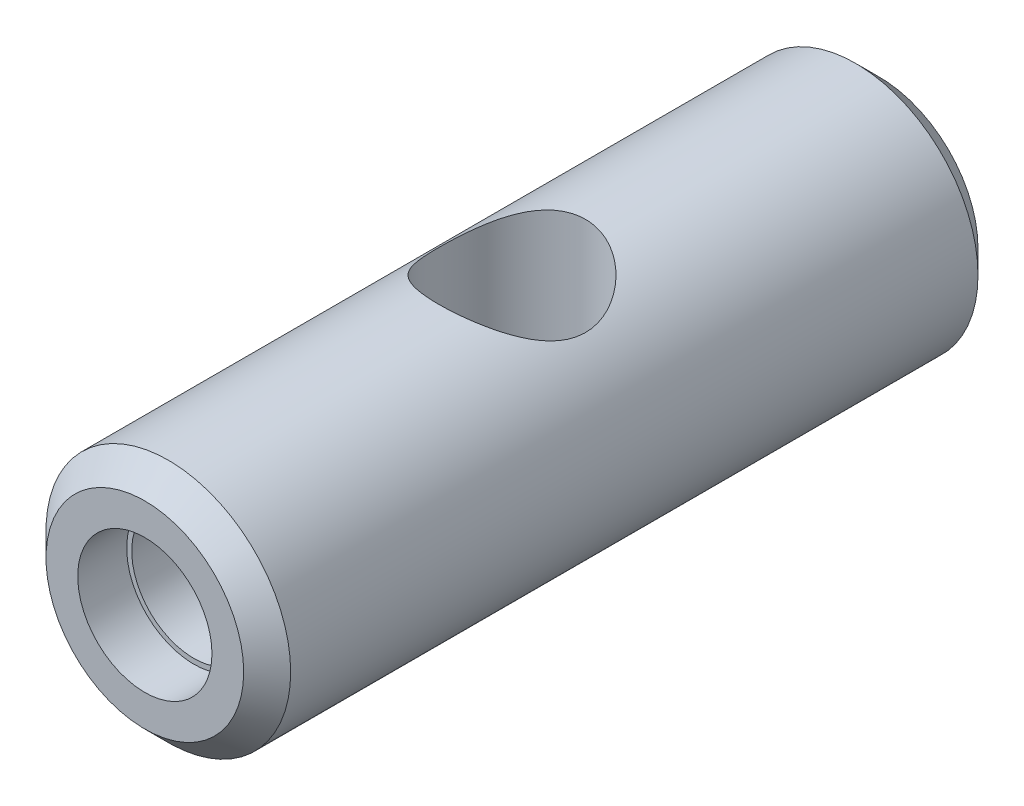
ISO-10303-21;
HEADER;
FILE_DESCRIPTION(('STEP AP214'),'2;1');
FILE_NAME('part.step','',(''),(''),'','','');
FILE_SCHEMA(('AUTOMOTIVE_DESIGN { 1 0 10303 214 1 1 1 1 }'));
ENDSEC;
DATA;
#1=APPLICATION_CONTEXT('core data for automotive mechanical design processes');
#2=APPLICATION_PROTOCOL_DEFINITION('international standard','automotive_design',2000,#1);
#3=PRODUCT_CONTEXT('',#1,'mechanical');
#4=PRODUCT('Part','Part','',(#3));
#5=PRODUCT_RELATED_PRODUCT_CATEGORY('part','',(#4));
#6=PRODUCT_DEFINITION_FORMATION('','',#4);
#7=PRODUCT_DEFINITION_CONTEXT('part definition',#1,'design');
#8=PRODUCT_DEFINITION('design','',#6,#7);
#9=PRODUCT_DEFINITION_SHAPE('','',#8);
#10=(LENGTH_UNIT() NAMED_UNIT(*) SI_UNIT(.MILLI.,.METRE.));
#11=(NAMED_UNIT(*) PLANE_ANGLE_UNIT() SI_UNIT($,.RADIAN.));
#12=(NAMED_UNIT(*) SI_UNIT($,.STERADIAN.) SOLID_ANGLE_UNIT());
#13=UNCERTAINTY_MEASURE_WITH_UNIT(LENGTH_MEASURE(1.E-05),#10,'distance_accuracy_value','');
#14=(GEOMETRIC_REPRESENTATION_CONTEXT(3) GLOBAL_UNCERTAINTY_ASSIGNED_CONTEXT((#13)) GLOBAL_UNIT_ASSIGNED_CONTEXT((#10,
#11,#12)) REPRESENTATION_CONTEXT('',''));
#15=CARTESIAN_POINT('',(0.,0.,0.));
#16=DIRECTION('',(0.,0.,1.));
#17=DIRECTION('',(1.,0.,0.));
#18=AXIS2_PLACEMENT_3D('',#15,#16,#17);
#19=CARTESIAN_POINT('',(0.,0.,-25.4));
#20=DIRECTION('',(0.,0.,1.));
#21=DIRECTION('',(1.,0.,0.));
#22=AXIS2_PLACEMENT_3D('',#19,#20,#21);
#23=CYLINDRICAL_SURFACE('',#22,4.0259);
#24=CARTESIAN_POINT('',(0.,-4.0259,-19.04365));
#25=CARTESIAN_POINT('',(0.0951715588788457,-4.02589935513259,-19.0436506331115));
#26=CARTESIAN_POINT('',(0.190354107953205,-4.02251895840561,-19.0465053689602));
#27=CARTESIAN_POINT('',(0.379943329002704,-4.00905897372343,-19.0578600865215));
#28=CARTESIAN_POINT('',(0.474349584862268,-3.9989760033567,-19.0663629185087));
#29=CARTESIAN_POINT('',(0.661725399407735,-3.97227339038087,-19.0888400955444));
#30=CARTESIAN_POINT('',(0.754692490282597,-3.95564358706478,-19.1028229454468));
#31=CARTESIAN_POINT('',(0.938369708770501,-3.91614297286615,-19.135949820088));
#32=CARTESIAN_POINT('',(1.0290787823465,-3.89326930483979,-19.1550962075728));
#33=CARTESIAN_POINT('',(1.29562606815811,-3.81617556891551,-19.2194137032415));
#34=CARTESIAN_POINT('',(1.46734750560896,-3.75326615257212,-19.2716477594938));
#35=CARTESIAN_POINT('',(1.79614622011273,-3.60751450934685,-19.391358600265));
#36=CARTESIAN_POINT('',(1.95322268697112,-3.52467118058041,-19.4588362273884));
#37=CARTESIAN_POINT('',(2.20461544028762,-3.37075096153011,-19.5822958889287));
#38=CARTESIAN_POINT('',(2.30319516550729,-3.30409808891044,-19.6352723562469));
#39=CARTESIAN_POINT('',(2.49260290452818,-3.16365299718268,-19.7454543488425));
#40=CARTESIAN_POINT('',(2.58343069259313,-3.08986057030431,-19.802659997183));
#41=CARTESIAN_POINT('',(2.7574898112071,-2.93558975073029,-19.9202966234904));
#42=CARTESIAN_POINT('',(2.84069922719046,-2.85509326819434,-19.9807361596509));
#43=CARTESIAN_POINT('',(2.99922106072844,-2.68808400410354,-20.1035044405636));
#44=CARTESIAN_POINT('',(3.07453630741205,-2.60157339651847,-20.1658324981091));
#45=CARTESIAN_POINT('',(3.21870449106821,-2.42103633512858,-20.2923798804203));
#46=CARTESIAN_POINT('',(3.28740407974945,-2.32689679550584,-20.3566124584585));
#47=CARTESIAN_POINT('',(3.41663775014599,-2.13262183181465,-20.4843220616276));
#48=CARTESIAN_POINT('',(3.47716910031853,-2.03248441807957,-20.547798827569));
#49=CARTESIAN_POINT('',(3.58975063536322,-1.82628854115363,-20.6720183644635));
#50=CARTESIAN_POINT('',(3.64181973339441,-1.72024401363257,-20.7327670063964));
#51=CARTESIAN_POINT('',(3.73721922060363,-1.50175340440687,-20.8492614220381));
#52=CARTESIAN_POINT('',(3.78055691727098,-1.38931277765736,-20.9050113573958));
#53=CARTESIAN_POINT('',(3.86078606192954,-1.14868775302973,-21.0123076820266));
#54=CARTESIAN_POINT('',(3.89693455014158,-1.01995657212935,-21.0632099377092));
#55=CARTESIAN_POINT('',(3.95681377650184,-0.75490137464773,-21.1501028571718));
#56=CARTESIAN_POINT('',(3.98057311092933,-0.618595654069689,-21.1861278199033));
#57=CARTESIAN_POINT('',(4.01416577040104,-0.338292281416504,-21.2377306106007));
#58=CARTESIAN_POINT('',(4.02380753565927,-0.194215842838437,-21.2530269710643));
#59=CARTESIAN_POINT('',(4.02737609382669,0.094589448677992,-21.2586410972348));
#60=CARTESIAN_POINT('',(4.02130972244747,0.239317990477822,-21.2489697281569));
#61=CARTESIAN_POINT('',(3.99353725703637,0.531250438537822,-21.2059293108918));
#62=CARTESIAN_POINT('',(3.9710262213837,0.678184904241885,-21.1713419194932));
#63=CARTESIAN_POINT('',(3.91158662420716,0.963734333838936,-21.0841017074641));
#64=CARTESIAN_POINT('',(3.87460830375961,1.10231865907645,-21.0313866148049));
#65=CARTESIAN_POINT('',(3.79643760260929,1.34457114228481,-20.9259011700013));
#66=CARTESIAN_POINT('',(3.75741596607552,1.44983594591551,-20.875083036772));
#67=CARTESIAN_POINT('',(3.67176909366173,1.65478844352906,-20.7687021483159));
#68=CARTESIAN_POINT('',(3.62513908377928,1.75447258274085,-20.7131364246288));
#69=CARTESIAN_POINT('',(3.52458337867779,1.94862773581721,-20.5992420893734));
#70=CARTESIAN_POINT('',(3.47064760008148,2.0430912859594,-20.540909732932));
#71=CARTESIAN_POINT('',(3.35571557831899,2.22683248364258,-20.4231228412301));
#72=CARTESIAN_POINT('',(3.29472084106919,2.31611123119758,-20.3636685475738));
#73=CARTESIAN_POINT('',(3.16160826742307,2.4950574676901,-20.2411059443956));
#74=CARTESIAN_POINT('',(3.08903000159169,2.58438945714769,-20.1780054071824));
#75=CARTESIAN_POINT('',(2.93595575354419,2.75705509394814,-20.0532629268971));
#76=CARTESIAN_POINT('',(2.85545863941941,2.84038788081694,-19.9916211939112));
#77=CARTESIAN_POINT('',(2.60230628237772,3.08056841009861,-19.8109038039301));
#78=CARTESIAN_POINT('',(2.41761600718959,3.22810521601429,-19.6956777062169));
#79=CARTESIAN_POINT('',(2.06027797912258,3.46388003845314,-19.5080062240492));
#80=CARTESIAN_POINT('',(1.89360155787462,3.55804596557551,-19.4316916506134));
#81=CARTESIAN_POINT('',(1.63059782381174,3.68217887963011,-19.330096692771));
#82=CARTESIAN_POINT('',(1.54073498011114,3.72071320911263,-19.2983699655973));
#83=CARTESIAN_POINT('',(1.35706995553349,3.79155740662172,-19.2398017728541));
#84=CARTESIAN_POINT('',(1.26326951365667,3.82386998791665,-19.2129581780624));
#85=CARTESIAN_POINT('',(1.07135801736249,3.88203673280484,-19.1644888257135));
#86=CARTESIAN_POINT('',(0.97321506029561,3.90782823968078,-19.1429137527357));
#87=CARTESIAN_POINT('',(0.774209783015942,3.95206932090219,-19.1058275204001));
#88=CARTESIAN_POINT('',(0.673348915136603,3.9705227364776,-19.0903131885348));
#89=CARTESIAN_POINT('',(0.469783907943892,3.9997175742964,-19.0657392104506));
#90=CARTESIAN_POINT('',(0.367080663706094,4.0104626427348,-19.0566765125014));
#91=CARTESIAN_POINT('',(0.160788164295875,4.02401542003004,-19.045242274409));
#92=CARTESIAN_POINT('',(0.0571990343426826,4.02682423266091,-19.0428698037894));
#93=CARTESIAN_POINT('',(-0.135791386723515,4.02460439542948,-19.0447437137804));
#94=CARTESIAN_POINT('',(-0.225214392000195,4.02058554724749,-19.0481373092685));
#95=CARTESIAN_POINT('',(-0.403278568047433,4.00664808885395,-19.0598926949992));
#96=CARTESIAN_POINT('',(-0.491919488906404,3.99672765750358,-19.0682560188236));
#97=CARTESIAN_POINT('',(-0.755624718579275,3.9583271315569,-19.1005781334519));
#98=CARTESIAN_POINT('',(-0.928657617716613,3.92120521706286,-19.1317713540441));
#99=CARTESIAN_POINT('',(-1.2633748173732,3.82647039332872,-19.2108412738463));
#100=CARTESIAN_POINT('',(-1.4251321444769,3.76900762472075,-19.258595679983));
#101=CARTESIAN_POINT('',(-1.73612170679848,3.63625789063966,-19.367838022489));
#102=CARTESIAN_POINT('',(-1.8853488790352,3.56096376666218,-19.4293314739177));
#103=CARTESIAN_POINT('',(-2.23247054664403,3.35859425165244,-19.5924130047978));
#104=CARTESIAN_POINT('',(-2.42293785658206,3.22330337996369,-19.6997459839458));
#105=CARTESIAN_POINT('',(-2.6858209761213,3.00124773148997,-19.8705043027415));
#106=CARTESIAN_POINT('',(-2.76977523091387,2.92388713810846,-19.9291638516733));
#107=CARTESIAN_POINT('',(-2.93008584925526,2.76320939002708,-20.0486598735178));
#108=CARTESIAN_POINT('',(-3.00644492059345,2.67989437649802,-20.109495560014));
#109=CARTESIAN_POINT('',(-3.15291035854061,2.50603181895416,-20.233329822469));
#110=CARTESIAN_POINT('',(-3.22287483831582,2.4153789520847,-20.2963475901092));
#111=CARTESIAN_POINT('',(-3.35494477283323,2.22830195904832,-20.4221329931941));
#112=CARTESIAN_POINT('',(-3.41704813778308,2.13187630824204,-20.484900557848));
#113=CARTESIAN_POINT('',(-3.53316714072,1.93334088743019,-20.6084664984085));
#114=CARTESIAN_POINT('',(-3.58719640789752,1.83124110454572,-20.6692680538057));
#115=CARTESIAN_POINT('',(-3.68698006500344,1.62098135328922,-20.7869332004435));
#116=CARTESIAN_POINT('',(-3.73273983724936,1.51282538715966,-20.8437993381238));
#117=CARTESIAN_POINT('',(-3.82124190875096,1.2744885481144,-20.9583865210099));
#118=CARTESIAN_POINT('',(-3.86268224119244,1.14333508474385,-21.0151291949601));
#119=CARTESIAN_POINT('',(-3.93268115653665,0.872550104417263,-21.1144153489219));
#120=CARTESIAN_POINT('',(-3.96126821336998,0.732938112692743,-21.1569901601134));
#121=CARTESIAN_POINT('',(-4.00048983370565,0.468049033544125,-21.2165193389078));
#122=CARTESIAN_POINT('',(-4.01316926852893,0.343748953619405,-21.2363522700583));
#123=CARTESIAN_POINT('',(-4.0267777819547,0.092982958293463,-21.2576660832136));
#124=CARTESIAN_POINT('',(-4.02771979286675,-0.0334804196531948,-21.2591671632405));
#125=CARTESIAN_POINT('',(-4.01779821303695,-0.284518342213485,-21.2435910066736));
#126=CARTESIAN_POINT('',(-4.00695239936,-0.409095444582191,-21.2265417455656));
#127=CARTESIAN_POINT('',(-3.97439872390949,-0.653692246122162,-21.1767961231894));
#128=CARTESIAN_POINT('',(-3.9526713467774,-0.773703338887147,-21.1440716540907));
#129=CARTESIAN_POINT('',(-3.90473257094528,-0.985049752225375,-21.0745424350363));
#130=CARTESIAN_POINT('',(-3.8801907274495,-1.0774562973558,-21.0397374026264));
#131=CARTESIAN_POINT('',(-3.82538790810174,-1.25825368723449,-20.9646061245642));
#132=CARTESIAN_POINT('',(-3.79512479045804,-1.34664301269322,-20.9242778128036));
#133=CARTESIAN_POINT('',(-3.72917687540338,-1.51977771758555,-20.839612585215));
#134=CARTESIAN_POINT('',(-3.69347361855541,-1.60450937957711,-20.7952622375339));
#135=CARTESIAN_POINT('',(-3.61700324159818,-1.77016265198485,-20.7040011234399));
#136=CARTESIAN_POINT('',(-3.57623761910449,-1.85108537948705,-20.6570911165503));
#137=CARTESIAN_POINT('',(-3.47139441622145,-2.04299260346833,-20.5414521464035));
#138=CARTESIAN_POINT('',(-3.40477727180074,-2.1521205495612,-20.4719307710747));
#139=CARTESIAN_POINT('',(-3.2617464538424,-2.36329135423157,-20.3321321424613));
#140=CARTESIAN_POINT('',(-3.18532868004988,-2.46533121969068,-20.2618545841532));
#141=CARTESIAN_POINT('',(-3.02286049377132,-2.66203364829714,-20.1225578353076));
#142=CARTESIAN_POINT('',(-2.9368257392441,-2.75670778967106,-20.0535368060514));
#143=CARTESIAN_POINT('',(-2.75501897908678,-2.9384117827701,-19.9183184156999));
#144=CARTESIAN_POINT('',(-2.65924625348248,-3.02544106838697,-19.8521212639017));
#145=CARTESIAN_POINT('',(-2.40487765542559,-3.23481741085485,-19.6904108212087));
#146=CARTESIAN_POINT('',(-2.23974497861063,-3.35164764639076,-19.5978031989163));
#147=CARTESIAN_POINT('',(-1.88769672353857,-3.56179638960859,-19.4288279786022));
#148=CARTESIAN_POINT('',(-1.70080726371199,-3.65514267196795,-19.3524412128703));
#149=CARTESIAN_POINT('',(-1.34038639178225,-3.80031705263691,-19.2326438890458));
#150=CARTESIAN_POINT('',(-1.16974978241095,-3.8564566902654,-19.1858701527754));
#151=CARTESIAN_POINT('',(-0.90672983051694,-3.92350854449651,-19.1297832973179));
#152=CARTESIAN_POINT('',(-0.817935364095775,-3.94299289199658,-19.1134389959769));
#153=CARTESIAN_POINT('',(-0.638494367056511,-3.97599035670888,-19.08571707655));
#154=CARTESIAN_POINT('',(-0.547848695734321,-3.98950618132664,-19.074337206557));
#155=CARTESIAN_POINT('',(-0.381066416016025,-4.00854654565481,-19.0582930045185));
#156=CARTESIAN_POINT('',(-0.305117082773612,-4.01504596905309,-19.0528100651968));
#157=CARTESIAN_POINT('',(-0.152780915615577,-4.02372338099039,-19.0454879496866));
#158=CARTESIAN_POINT('',(-0.0763939984295945,-4.02590051763363,-19.0436494918028));
#159=CARTESIAN_POINT('',(0.,-4.0259,-19.04365));
#160=B_SPLINE_CURVE_WITH_KNOTS('',3,(#24,#25,#26,#27,#28,#29,#30,#31,#32,#33,#34,#35,#36,#37,
#38,#39,#40,#41,#42,#43,#44,#45,#46,#47,#48,#49,#50,#51,#52,#53,#54,#55,#56,#57,#58,#59,#60,#61,
#62,#63,#64,#65,#66,#67,#68,#69,#70,#71,#72,#73,#74,#75,#76,#77,#78,#79,#80,#81,#82,#83,#84,#85,
#86,#87,#88,#89,#90,#91,#92,#93,#94,#95,#96,#97,#98,#99,#100,#101,#102,#103,#104,#105,#106,#107,
#108,#109,#110,#111,#112,#113,#114,#115,#116,#117,#118,#119,#120,#121,#122,#123,#124,#125,#126,
#127,#128,#129,#130,#131,#132,#133,#134,#135,#136,#137,#138,#139,#140,#141,#142,#143,#144,#145,
#146,#147,#148,#149,#150,#151,#152,#153,#154,#155,#156,#157,#158,#159),.UNSPECIFIED.,.T.,.F.,(4,
2,2,2,2,2,2,2,2,2,2,2,2,2,2,2,2,2,2,2,2,2,2,2,2,2,2,2,2,2,2,2,2,2,2,2,2,2,2,2,2,2,2,2,2,2,2,2,2,
2,2,2,2,2,2,2,2,2,2,2,2,2,2,2,2,2,2,4),(0.,0.285431473630227,0.571007097915978,
0.857027694973301,1.14317939286392,1.71107047607945,2.27899295775928,2.66928558824058,
3.05958958016074,3.4509831673961,3.84223600308718,4.24106387321645,4.64002478669595,
5.0380813799736,5.43580343483286,5.86383550296192,6.29087517734821,6.72365726983344,
7.15625106014092,7.61157265105999,8.06847424500016,8.43768855942185,8.80713544086362,
9.17709752743766,9.54698083347918,9.94035815788648,10.3337917930044,11.1185076025584,
11.7342399504581,12.0422985149971,12.3502224311937,12.6610012589661,12.97161719024,
13.2820860972093,13.592511822054,13.8609013562343,14.1293737543351,14.6657674822405,
15.198281801171,15.7310102646466,16.4978193882479,16.8826019739934,17.267246883928,
17.659011025345,18.0508790952708,18.4420780274535,18.8330214179855,19.278266520379,
19.7225203495127,20.1003628868724,20.4777890799533,20.8546468702967,21.2321829633106,
21.5370067559186,21.8419448878351,22.1479417754891,22.4538483538129,22.8898925793928,
23.3261198300182,23.7616469041262,24.197206202255,24.8619862398534,25.5259763003868,
26.080259500123,26.3570633473161,26.6337415031049,26.862811567724,27.0919267761448),.UNSPECIFIED.);
#161=CARTESIAN_POINT('',(0.,-4.0259,-19.04365));
#162=VERTEX_POINT('',#161);
#163=EDGE_CURVE('E61',#162,#162,#160,.T.);
#164=ORIENTED_EDGE('',*,*,#163,.F.);
#165=EDGE_LOOP('',(#164));
#166=FACE_BOUND('',#165,.T.);
#167=CARTESIAN_POINT('',(0.,0.,-3.175));
#168=DIRECTION('',(0.,0.,1.));
#169=DIRECTION('',(1.,0.,0.));
#170=AXIS2_PLACEMENT_3D('',#167,#168,#169);
#171=CIRCLE('',#170,4.0259);
#172=CARTESIAN_POINT('',(4.0259,0.,-3.175));
#173=VERTEX_POINT('',#172);
#174=EDGE_CURVE('E58',#173,#173,#171,.F.);
#175=ORIENTED_EDGE('',*,*,#174,.F.);
#176=EDGE_LOOP('',(#175));
#177=FACE_BOUND('',#176,.T.);
#178=ADVANCED_FACE('F37',(#166,#177),#23,.F.);
#179=CARTESIAN_POINT('',(0.,0.,-47.625));
#180=DIRECTION('',(0.,0.,1.));
#181=DIRECTION('',(1.,0.,0.));
#182=AXIS2_PLACEMENT_3D('',#179,#180,#181);
#183=CYLINDRICAL_SURFACE('',#182,7.934325);
#184=CARTESIAN_POINT('',(0.,0.,-1.524));
#185=DIRECTION('',(0.,0.,1.));
#186=DIRECTION('',(1.,0.,0.));
#187=AXIS2_PLACEMENT_3D('',#184,#185,#186);
#188=CIRCLE('',#187,7.934325);
#189=CARTESIAN_POINT('',(7.934325,0.,-1.524));
#190=VERTEX_POINT('',#189);
#191=EDGE_CURVE('E44',#190,#190,#188,.F.);
#192=ORIENTED_EDGE('',*,*,#191,.T.);
#193=EDGE_LOOP('',(#192));
#194=FACE_BOUND('',#193,.T.);
#195=CARTESIAN_POINT('',(0.,0.,-46.101));
#196=DIRECTION('',(0.,0.,1.));
#197=DIRECTION('',(1.,0.,0.));
#198=AXIS2_PLACEMENT_3D('',#195,#196,#197);
#199=CIRCLE('',#198,7.934325);
#200=CARTESIAN_POINT('',(7.934325,0.,-46.101));
#201=VERTEX_POINT('',#200);
#202=EDGE_CURVE('E48',#201,#201,#199,.T.);
#203=ORIENTED_EDGE('',*,*,#202,.T.);
#204=EDGE_LOOP('',(#203));
#205=FACE_BOUND('',#204,.T.);
#206=CARTESIAN_POINT('',(0.,-7.934325,-19.04365));
#207=CARTESIAN_POINT('',(-0.121998710310067,-7.93432407647149,-19.0436509904028));
#208=CARTESIAN_POINT('',(-0.244027276625139,-7.93150409666505,-19.04833880699));
#209=CARTESIAN_POINT('',(-0.487163118092591,-7.92029117843701,-19.0670301849558));
#210=CARTESIAN_POINT('',(-0.608269818807731,-7.91189501369001,-19.0810391394614));
#211=CARTESIAN_POINT('',(-0.848803251117148,-7.88971854240973,-19.1182163586078));
#212=CARTESIAN_POINT('',(-0.968226398408646,-7.87592814857617,-19.141401784373));
#213=CARTESIAN_POINT('',(-1.20434466755284,-7.84329536254847,-19.1966365887353));
#214=CARTESIAN_POINT('',(-1.32103859844751,-7.82445080797767,-19.2286897615028));
#215=CARTESIAN_POINT('',(-1.55027307086239,-7.78226641789088,-19.3010757142975));
#216=CARTESIAN_POINT('',(-1.66283273722586,-7.75895156798095,-19.3413625531558));
#217=CARTESIAN_POINT('',(-1.88385262323098,-7.70827429169648,-19.4298956244942));
#218=CARTESIAN_POINT('',(-1.99231125972619,-7.68091032184456,-19.4781448929716));
#219=CARTESIAN_POINT('',(-2.31054992664972,-7.59362366086156,-19.6341024818223));
#220=CARTESIAN_POINT('',(-2.51348042951718,-7.52845108057322,-19.7531126918809));
#221=CARTESIAN_POINT('',(-2.91228820097745,-7.38380381214094,-20.0278391559059));
#222=CARTESIAN_POINT('',(-3.10643384833613,-7.30361591452378,-20.1856691015498));
#223=CARTESIAN_POINT('',(-3.4672128678974,-7.13941776108765,-20.5288395816349));
#224=CARTESIAN_POINT('',(-3.63381031712325,-7.05540269379271,-20.7142154476075));
#225=CARTESIAN_POINT('',(-3.95553185078357,-6.88075095463413,-21.1340587980984));
#226=CARTESIAN_POINT('',(-4.10671691999644,-6.79057285515544,-21.3717604845062));
#227=CARTESIAN_POINT('',(-4.36643753068952,-6.62656939253625,-21.8744981569488));
#228=CARTESIAN_POINT('',(-4.47504242813899,-6.55271752301784,-22.1394887972059));
#229=CARTESIAN_POINT('',(-4.62349252974233,-6.44848684347779,-22.623824727031));
#230=CARTESIAN_POINT('',(-4.67362084614294,-6.41191089524077,-22.8386788565878));
#231=CARTESIAN_POINT('',(-4.74368716375257,-6.36026051294505,-23.2756817231718));
#232=CARTESIAN_POINT('',(-4.76366290317848,-6.34515920313598,-23.4978209857411));
#233=CARTESIAN_POINT('',(-4.77226836562658,-6.3386914625355,-23.9435044959877));
#234=CARTESIAN_POINT('',(-4.76083580581441,-6.34737219156635,-24.1670506569868));
#235=CARTESIAN_POINT('',(-4.70722256429792,-6.38722334294965,-24.6084240687359));
#236=CARTESIAN_POINT('',(-4.66501868591849,-6.41841073155877,-24.8262468765758));
#237=CARTESIAN_POINT('',(-4.5528797053603,-6.49841569400205,-25.2478503537404));
#238=CARTESIAN_POINT('',(-4.48332071305543,-6.54699338533531,-25.4517792011259));
#239=CARTESIAN_POINT('',(-4.31902539718567,-6.6565196228475,-25.8456075266203));
#240=CARTESIAN_POINT('',(-4.22427985876583,-6.71747269480273,-26.0355018374318));
#241=CARTESIAN_POINT('',(-3.99318642664524,-6.85779041275637,-26.4312276526469));
#242=CARTESIAN_POINT('',(-3.85245678565856,-6.93850937530029,-26.6340151005888));
#243=CARTESIAN_POINT('',(-3.54183272381211,-7.10209372511877,-27.0152860147986));
#244=CARTESIAN_POINT('',(-3.37191032125759,-7.18496110637144,-27.1937458656073));
#245=CARTESIAN_POINT('',(-3.0841938115768,-7.31124783144978,-27.4524799450304));
#246=CARTESIAN_POINT('',(-2.97532471297594,-7.35633419689208,-27.542022866632));
#247=CARTESIAN_POINT('',(-2.74937885635697,-7.44372735307314,-27.7115740124979));
#248=CARTESIAN_POINT('',(-2.63230530262796,-7.4860352166008,-27.7915859265431));
#249=CARTESIAN_POINT('',(-2.390484731453,-7.56672642752402,-27.9413917230747));
#250=CARTESIAN_POINT('',(-2.26573669584506,-7.6051092523845,-28.0111842456001));
#251=CARTESIAN_POINT('',(-2.00936924205391,-7.67682524754687,-28.1397286396377));
#252=CARTESIAN_POINT('',(-1.87775412066976,-7.71016152575587,-28.1984873117335));
#253=CARTESIAN_POINT('',(-1.61689751140809,-7.76890615283932,-28.3009260256757));
#254=CARTESIAN_POINT('',(-1.48801735837824,-7.79467858594848,-28.345316506636));
#255=CARTESIAN_POINT('',(-1.22600006376627,-7.84015950940856,-28.4230871667201));
#256=CARTESIAN_POINT('',(-1.09286535418307,-7.85987139799958,-28.4564735167877));
#257=CARTESIAN_POINT('',(-0.823517378338191,-7.89263729287893,-28.5117164375795));
#258=CARTESIAN_POINT('',(-0.687306463145807,-7.90569621527228,-28.5335815221731));
#259=CARTESIAN_POINT('',(-0.413019962571409,-7.92475970305339,-28.5654357381536));
#260=CARTESIAN_POINT('',(-0.274944644419852,-7.93076526878793,-28.5754265536185));
#261=CARTESIAN_POINT('',(-0.0172467366892623,-7.93520557241159,-28.582815319086));
#262=CARTESIAN_POINT('',(0.10231924958748,-7.9345626768473,-28.5817474505605));
#263=CARTESIAN_POINT('',(0.340922859505038,-7.92789581027926,-28.5706476668667));
#264=CARTESIAN_POINT('',(0.459960308649052,-7.92187017822441,-28.5606129846417));
#265=CARTESIAN_POINT('',(0.696523880026197,-7.904582271861,-28.5317132281361));
#266=CARTESIAN_POINT('',(0.814050617379777,-7.89332220306157,-28.5128518729168));
#267=CARTESIAN_POINT('',(1.04682675544888,-7.86583983844359,-28.4665511925673));
#268=CARTESIAN_POINT('',(1.16207525973049,-7.84961562915303,-28.4391085596175));
#269=CARTESIAN_POINT('',(1.49746843223666,-7.79495730895036,-28.3459665838254));
#270=CARTESIAN_POINT('',(1.71346936473485,-7.75004980162328,-28.2686640186495));
#271=CARTESIAN_POINT('',(2.12925651858259,-7.64629751451049,-28.085664657313));
#272=CARTESIAN_POINT('',(2.32903955468905,-7.58745000571658,-27.9799623008335));
#273=CARTESIAN_POINT('',(2.7292895197666,-7.45342038178012,-27.730924369916));
#274=CARTESIAN_POINT('',(2.92767935017765,-7.37717723500917,-27.584823070205));
#275=CARTESIAN_POINT('',(3.29861326898592,-7.2189638063985,-27.2652030028798));
#276=CARTESIAN_POINT('',(3.47112684488635,-7.13698692788414,-27.0916523553827));
#277=CARTESIAN_POINT('',(3.80868872310439,-6.96332752296703,-26.6955738482312));
#278=CARTESIAN_POINT('',(3.96980016021814,-6.87178000627102,-26.4696083825688));
#279=CARTESIAN_POINT('',(4.25190845380842,-6.70089696563338,-25.9897715142349));
#280=CARTESIAN_POINT('',(4.37294705294241,-6.62154878047647,-25.7359295192131));
#281=CARTESIAN_POINT('',(4.54852870755725,-6.50178647438949,-25.2623177726566));
#282=CARTESIAN_POINT('',(4.61178544315072,-6.45666537998285,-25.0470200887586));
#283=CARTESIAN_POINT('',(4.68367501408096,-6.40449387317345,-24.7168463694249));
#284=CARTESIAN_POINT('',(4.70380445068048,-6.38968934467701,-24.6055994214172));
#285=CARTESIAN_POINT('',(4.73615053355921,-6.36575273778317,-24.3813738531019));
#286=CARTESIAN_POINT('',(4.74837021780444,-6.35661848161125,-24.268395914718));
#287=CARTESIAN_POINT('',(4.76473822975454,-6.34435866511912,-24.0410667922457));
#288=CARTESIAN_POINT('',(4.76885339505172,-6.34125779307124,-23.9267118844532));
#289=CARTESIAN_POINT('',(4.76884660067395,-6.34126291931118,-23.6980025718457));
#290=CARTESIAN_POINT('',(4.76472462781854,-6.3443689275308,-23.5836481670316));
#291=CARTESIAN_POINT('',(4.74830717451711,-6.35666562680895,-23.3558248703008));
#292=CARTESIAN_POINT('',(4.73600943046489,-6.36585800298273,-23.2423562324293));
#293=CARTESIAN_POINT('',(4.70343990081645,-6.38995828399458,-23.0171703593177));
#294=CARTESIAN_POINT('',(4.68316499329636,-6.40486842646623,-22.9054538275989));
#295=CARTESIAN_POINT('',(4.61319002435834,-6.45563725495713,-22.5851227717312));
#296=CARTESIAN_POINT('',(4.55342279910863,-6.49827841546187,-22.3796841313491));
#297=CARTESIAN_POINT('',(4.40853040302579,-6.59742498592357,-21.9817110821368));
#298=CARTESIAN_POINT('',(4.32339566882824,-6.65393562315215,-21.7891815735471));
#299=CARTESIAN_POINT('',(4.11517488981153,-6.78499565727348,-21.3906793490364));
#300=CARTESIAN_POINT('',(3.98827125815326,-6.86098236932851,-21.1871719165711));
#301=CARTESIAN_POINT('',(3.70647779127902,-7.01723401568309,-20.8023548497693));
#302=CARTESIAN_POINT('',(3.55156487739954,-7.09750243922238,-20.621063729125));
#303=CARTESIAN_POINT('',(3.1879835000712,-7.2688966429068,-20.2550325360364));
#304=CARTESIAN_POINT('',(2.97466362526038,-7.35963295232182,-20.0746432557742));
#305=CARTESIAN_POINT('',(2.63122289578661,-7.4863338049066,-19.8327660905435));
#306=CARTESIAN_POINT('',(2.51272334088219,-7.52703030221017,-19.7568733017418));
#307=CARTESIAN_POINT('',(2.26846289250966,-7.6042059682015,-19.615370823727));
#308=CARTESIAN_POINT('',(2.14270614411138,-7.64068750927503,-19.5497553424666));
#309=CARTESIAN_POINT('',(1.88838210838733,-7.70741968658778,-19.4312834596226));
#310=CARTESIAN_POINT('',(1.75999957355445,-7.73781930858453,-19.3781144664956));
#311=CARTESIAN_POINT('',(1.49802951134396,-7.79277306014079,-19.2829038407075));
#312=CARTESIAN_POINT('',(1.36444507378329,-7.81733059995201,-19.2408557147516));
#313=CARTESIAN_POINT('',(1.09350732892,-7.85980316078184,-19.168603529171));
#314=CARTESIAN_POINT('',(0.956166256124544,-7.87773749765509,-19.1383650130179));
#315=CARTESIAN_POINT('',(0.678699283417783,-7.90647193886278,-19.0900964755283));
#316=CARTESIAN_POINT('',(0.538575791720056,-7.91727795742591,-19.0720563331234));
#317=CARTESIAN_POINT('',(0.331698420409033,-7.92766563416936,-19.0547363960127));
#318=CARTESIAN_POINT('',(0.265457324881716,-7.93016067383068,-19.0505812805285));
#319=CARTESIAN_POINT('',(0.132813772496516,-7.93349063838146,-19.045037762508));
#320=CARTESIAN_POINT('',(0.0664113098427833,-7.93432550273268,-19.0436494608636));
#321=CARTESIAN_POINT('',(0.,-7.934325,-19.04365));
#322=B_SPLINE_CURVE_WITH_KNOTS('',3,(#206,#207,#208,#209,#210,#211,#212,#213,#214,#215,#216,
#217,#218,#219,#220,#221,#222,#223,#224,#225,#226,#227,#228,#229,#230,#231,#232,#233,#234,#235,
#236,#237,#238,#239,#240,#241,#242,#243,#244,#245,#246,#247,#248,#249,#250,#251,#252,#253,#254,
#255,#256,#257,#258,#259,#260,#261,#262,#263,#264,#265,#266,#267,#268,#269,#270,#271,#272,#273,
#274,#275,#276,#277,#278,#279,#280,#281,#282,#283,#284,#285,#286,#287,#288,#289,#290,#291,#292,
#293,#294,#295,#296,#297,#298,#299,#300,#301,#302,#303,#304,#305,#306,#307,#308,#309,#310,#311,
#312,#313,#314,#315,#316,#317,#318,#319,#320,#321),.UNSPECIFIED.,.T.,.F.,(4,2,2,2,2,2,2,2,2,2,2,
2,2,2,2,2,2,2,2,2,2,2,2,2,2,2,2,2,2,2,2,2,2,2,2,2,2,2,2,2,2,2,2,2,2,2,2,2,2,2,2,2,2,2,2,2,2,4),
(0.,0.36592622698699,0.732064359929594,1.09889047611613,1.46587378656938,1.83086276911588,
2.19599124134154,2.92533725867347,3.71056335252588,4.49680544508699,5.37986525999547,
6.26148068256733,6.92954870278276,7.59677989033602,8.26533515562196,8.93439492690129,
9.5945603967138,10.2549677306345,11.0311754669513,11.8081314037613,12.2516458832192,
12.6949881010764,13.1383892638548,13.5815162380771,13.9970877741235,14.4124258660914,
14.8274566037142,15.2424284722287,15.6006975011257,15.9590771259652,16.3173058856467,
16.6756729021096,17.3738065664093,18.0720770161561,18.8427514870556,19.6143276881764,
20.4869570580091,21.358674555194,22.0422346875591,22.3839226010169,22.7254792014928,
23.0684305174294,23.4113823821323,23.7544292386627,24.0976104829555,24.7493042926767,
25.4012440976862,26.1531479000134,26.9056740916359,27.7821562618064,28.2211336450782,
28.6598627339383,29.0859782004317,29.5118443129437,29.9364584370895,30.3607198224766,
30.5599084357683,30.7591043123334),.UNSPECIFIED.);
#323=CARTESIAN_POINT('',(0.,-7.934325,-19.04365));
#324=VERTEX_POINT('',#323);
#325=EDGE_CURVE('E57',#324,#324,#322,.T.);
#326=ORIENTED_EDGE('',*,*,#325,.F.);
#327=EDGE_LOOP('',(#326));
#328=FACE_BOUND('',#327,.T.);
#329=CARTESIAN_POINT('',(0.,7.934325,-19.04365));
#330=CARTESIAN_POINT('',(0.121998710310064,7.93432407647149,-19.0436509904028));
#331=CARTESIAN_POINT('',(0.244027276625135,7.93150409666505,-19.04833880699));
#332=CARTESIAN_POINT('',(0.487163118092587,7.92029117843701,-19.0670301849558));
#333=CARTESIAN_POINT('',(0.608269818807727,7.91189501369001,-19.0810391394614));
#334=CARTESIAN_POINT('',(0.848803251117144,7.88971854240973,-19.1182163586078));
#335=CARTESIAN_POINT('',(0.968226398408642,7.87592814857617,-19.141401784373));
#336=CARTESIAN_POINT('',(1.20434466755283,7.84329536254847,-19.1966365887353));
#337=CARTESIAN_POINT('',(1.3210385984475,7.82445080797767,-19.2286897615028));
#338=CARTESIAN_POINT('',(1.55027307086238,7.78226641789088,-19.3010757142975));
#339=CARTESIAN_POINT('',(1.66283273722586,7.75895156798095,-19.3413625531558));
#340=CARTESIAN_POINT('',(1.88385262323097,7.70827429169648,-19.4298956244942));
#341=CARTESIAN_POINT('',(1.99231125972619,7.68091032184456,-19.4781448929716));
#342=CARTESIAN_POINT('',(2.31054992664971,7.59362366086157,-19.6341024818223));
#343=CARTESIAN_POINT('',(2.51348042951718,7.52845108057322,-19.7531126918809));
#344=CARTESIAN_POINT('',(2.91228820097745,7.38380381214095,-20.0278391559059));
#345=CARTESIAN_POINT('',(3.10643384833613,7.30361591452379,-20.1856691015498));
#346=CARTESIAN_POINT('',(3.4672128678974,7.13941776108766,-20.5288395816349));
#347=CARTESIAN_POINT('',(3.63381031712325,7.05540269379271,-20.7142154476075));
#348=CARTESIAN_POINT('',(3.95553185078357,6.88075095463413,-21.1340587980984));
#349=CARTESIAN_POINT('',(4.10671691999644,6.79057285515544,-21.3717604845062));
#350=CARTESIAN_POINT('',(4.36643753068952,6.62656939253625,-21.8744981569488));
#351=CARTESIAN_POINT('',(4.47504242813899,6.55271752301785,-22.1394887972059));
#352=CARTESIAN_POINT('',(4.62349252974233,6.4484868434778,-22.6238247270309));
#353=CARTESIAN_POINT('',(4.67362084614293,6.41191089524077,-22.8386788565878));
#354=CARTESIAN_POINT('',(4.74368716375257,6.36026051294505,-23.2756817231718));
#355=CARTESIAN_POINT('',(4.76366290317847,6.34515920313598,-23.497820985741));
#356=CARTESIAN_POINT('',(4.77226836562657,6.3386914625355,-23.9435044959877));
#357=CARTESIAN_POINT('',(4.76083580581441,6.34737219156635,-24.1670506569868));
#358=CARTESIAN_POINT('',(4.70722256429791,6.38722334294965,-24.6084240687359));
#359=CARTESIAN_POINT('',(4.66501868591848,6.41841073155877,-24.8262468765758));
#360=CARTESIAN_POINT('',(4.55287970536029,6.49841569400205,-25.2478503537404));
#361=CARTESIAN_POINT('',(4.48332071305543,6.54699338533532,-25.4517792011259));
#362=CARTESIAN_POINT('',(4.31902539718567,6.65651962284751,-25.8456075266203));
#363=CARTESIAN_POINT('',(4.22427985876582,6.71747269480273,-26.0355018374318));
#364=CARTESIAN_POINT('',(3.99318642664523,6.85779041275637,-26.4312276526469));
#365=CARTESIAN_POINT('',(3.85245678565856,6.93850937530029,-26.6340151005888));
#366=CARTESIAN_POINT('',(3.54183272381211,7.10209372511877,-27.0152860147986));
#367=CARTESIAN_POINT('',(3.37191032125759,7.18496110637143,-27.1937458656073));
#368=CARTESIAN_POINT('',(3.0841938115768,7.31124783144978,-27.4524799450304));
#369=CARTESIAN_POINT('',(2.97532471297594,7.35633419689208,-27.542022866632));
#370=CARTESIAN_POINT('',(2.74937885635697,7.44372735307314,-27.7115740124979));
#371=CARTESIAN_POINT('',(2.63230530262795,7.4860352166008,-27.7915859265431));
#372=CARTESIAN_POINT('',(2.390484731453,7.56672642752403,-27.9413917230747));
#373=CARTESIAN_POINT('',(2.26573669584505,7.60510925238451,-28.0111842456001));
#374=CARTESIAN_POINT('',(2.00936924205391,7.67682524754688,-28.1397286396377));
#375=CARTESIAN_POINT('',(1.87775412066975,7.71016152575587,-28.1984873117335));
#376=CARTESIAN_POINT('',(1.61689751140809,7.76890615283932,-28.3009260256757));
#377=CARTESIAN_POINT('',(1.48801735837823,7.79467858594848,-28.345316506636));
#378=CARTESIAN_POINT('',(1.22600006376626,7.84015950940856,-28.4230871667201));
#379=CARTESIAN_POINT('',(1.09286535418306,7.85987139799958,-28.4564735167877));
#380=CARTESIAN_POINT('',(0.823517378338183,7.89263729287893,-28.5117164375795));
#381=CARTESIAN_POINT('',(0.6873064631458,7.90569621527228,-28.5335815221731));
#382=CARTESIAN_POINT('',(0.413019962571404,7.92475970305339,-28.5654357381536));
#383=CARTESIAN_POINT('',(0.274944644419848,7.93076526878793,-28.5754265536185));
#384=CARTESIAN_POINT('',(0.0172467366892591,7.93520557241159,-28.582815319086));
#385=CARTESIAN_POINT('',(-0.102319249587483,7.9345626768473,-28.5817474505605));
#386=CARTESIAN_POINT('',(-0.34092285950504,7.92789581027926,-28.5706476668667));
#387=CARTESIAN_POINT('',(-0.459960308649054,7.92187017822441,-28.5606129846417));
#388=CARTESIAN_POINT('',(-0.696523880026199,7.904582271861,-28.5317132281361));
#389=CARTESIAN_POINT('',(-0.81405061737978,7.89332220306157,-28.5128518729168));
#390=CARTESIAN_POINT('',(-1.04682675544889,7.86583983844359,-28.4665511925673));
#391=CARTESIAN_POINT('',(-1.16207525973049,7.84961562915303,-28.4391085596175));
#392=CARTESIAN_POINT('',(-1.49746843223666,7.79495730895036,-28.3459665838254));
#393=CARTESIAN_POINT('',(-1.71346936473486,7.75004980162328,-28.2686640186495));
#394=CARTESIAN_POINT('',(-2.12925651858259,7.64629751451049,-28.085664657313));
#395=CARTESIAN_POINT('',(-2.32903955468905,7.58745000571657,-27.9799623008335));
#396=CARTESIAN_POINT('',(-2.7292895197666,7.45342038178012,-27.730924369916));
#397=CARTESIAN_POINT('',(-2.92767935017766,7.37717723500917,-27.584823070205));
#398=CARTESIAN_POINT('',(-3.29861326898592,7.2189638063985,-27.2652030028798));
#399=CARTESIAN_POINT('',(-3.47112684488636,7.13698692788414,-27.0916523553827));
#400=CARTESIAN_POINT('',(-3.8086887231044,6.96332752296703,-26.6955738482312));
#401=CARTESIAN_POINT('',(-3.96980016021815,6.87178000627103,-26.4696083825688));
#402=CARTESIAN_POINT('',(-4.25190845380842,6.70089696563338,-25.9897715142349));
#403=CARTESIAN_POINT('',(-4.37294705294241,6.62154878047647,-25.7359295192131));
#404=CARTESIAN_POINT('',(-4.54852870755726,6.50178647438949,-25.2623177726566));
#405=CARTESIAN_POINT('',(-4.61178544315072,6.45666537998285,-25.0470200887586));
#406=CARTESIAN_POINT('',(-4.68367501408096,6.40449387317345,-24.7168463694249));
#407=CARTESIAN_POINT('',(-4.70380445068048,6.389689344677,-24.6055994214172));
#408=CARTESIAN_POINT('',(-4.73615053355921,6.36575273778317,-24.3813738531019));
#409=CARTESIAN_POINT('',(-4.74837021780444,6.35661848161125,-24.268395914718));
#410=CARTESIAN_POINT('',(-4.76473822975454,6.34435866511912,-24.0410667922457));
#411=CARTESIAN_POINT('',(-4.76885339505172,6.34125779307124,-23.9267118844532));
#412=CARTESIAN_POINT('',(-4.76884660067396,6.34126291931118,-23.6980025718457));
#413=CARTESIAN_POINT('',(-4.76472462781855,6.3443689275308,-23.5836481670316));
#414=CARTESIAN_POINT('',(-4.74830717451712,6.35666562680894,-23.3558248703008));
#415=CARTESIAN_POINT('',(-4.73600943046489,6.36585800298272,-23.2423562324293));
#416=CARTESIAN_POINT('',(-4.70343990081645,6.38995828399458,-23.0171703593177));
#417=CARTESIAN_POINT('',(-4.68316499329636,6.40486842646623,-22.9054538275989));
#418=CARTESIAN_POINT('',(-4.61319002435835,6.45563725495713,-22.5851227717312));
#419=CARTESIAN_POINT('',(-4.55342279910864,6.49827841546187,-22.3796841313491));
#420=CARTESIAN_POINT('',(-4.40853040302579,6.59742498592357,-21.9817110821368));
#421=CARTESIAN_POINT('',(-4.32339566882825,6.65393562315215,-21.7891815735471));
#422=CARTESIAN_POINT('',(-4.11517488981153,6.78499565727348,-21.3906793490364));
#423=CARTESIAN_POINT('',(-3.98827125815326,6.86098236932851,-21.1871719165711));
#424=CARTESIAN_POINT('',(-3.70647779127903,7.01723401568309,-20.8023548497693));
#425=CARTESIAN_POINT('',(-3.55156487739954,7.09750243922238,-20.621063729125));
#426=CARTESIAN_POINT('',(-3.1879835000712,7.2688966429068,-20.2550325360364));
#427=CARTESIAN_POINT('',(-2.97466362526038,7.35963295232182,-20.0746432557742));
#428=CARTESIAN_POINT('',(-2.63122289578661,7.4863338049066,-19.8327660905435));
#429=CARTESIAN_POINT('',(-2.51272334088219,7.52703030221017,-19.7568733017418));
#430=CARTESIAN_POINT('',(-2.26846289250967,7.60420596820149,-19.615370823727));
#431=CARTESIAN_POINT('',(-2.14270614411139,7.64068750927502,-19.5497553424666));
#432=CARTESIAN_POINT('',(-1.88838210838734,7.70741968658777,-19.4312834596226));
#433=CARTESIAN_POINT('',(-1.75999957355446,7.73781930858453,-19.3781144664956));
#434=CARTESIAN_POINT('',(-1.49802951134397,7.79277306014079,-19.2829038407075));
#435=CARTESIAN_POINT('',(-1.3644450737833,7.81733059995201,-19.2408557147516));
#436=CARTESIAN_POINT('',(-1.09350732892001,7.85980316078184,-19.168603529171));
#437=CARTESIAN_POINT('',(-0.956166256124552,7.87773749765509,-19.1383650130179));
#438=CARTESIAN_POINT('',(-0.67869928341779,7.90647193886278,-19.0900964755283));
#439=CARTESIAN_POINT('',(-0.538575791720062,7.91727795742591,-19.0720563331234));
#440=CARTESIAN_POINT('',(-0.331698420409038,7.92766563416936,-19.0547363960127));
#441=CARTESIAN_POINT('',(-0.265457324881721,7.93016067383068,-19.0505812805285));
#442=CARTESIAN_POINT('',(-0.132813772496522,7.93349063838146,-19.045037762508));
#443=CARTESIAN_POINT('',(-0.0664113098427876,7.93432550273268,-19.0436494608636));
#444=CARTESIAN_POINT('',(0.,7.934325,-19.04365));
#445=B_SPLINE_CURVE_WITH_KNOTS('',3,(#329,#330,#331,#332,#333,#334,#335,#336,#337,#338,#339,
#340,#341,#342,#343,#344,#345,#346,#347,#348,#349,#350,#351,#352,#353,#354,#355,#356,#357,#358,
#359,#360,#361,#362,#363,#364,#365,#366,#367,#368,#369,#370,#371,#372,#373,#374,#375,#376,#377,
#378,#379,#380,#381,#382,#383,#384,#385,#386,#387,#388,#389,#390,#391,#392,#393,#394,#395,#396,
#397,#398,#399,#400,#401,#402,#403,#404,#405,#406,#407,#408,#409,#410,#411,#412,#413,#414,#415,
#416,#417,#418,#419,#420,#421,#422,#423,#424,#425,#426,#427,#428,#429,#430,#431,#432,#433,#434,
#435,#436,#437,#438,#439,#440,#441,#442,#443,#444),.UNSPECIFIED.,.T.,.F.,(4,2,2,2,2,2,2,2,2,2,2,
2,2,2,2,2,2,2,2,2,2,2,2,2,2,2,2,2,2,2,2,2,2,2,2,2,2,2,2,2,2,2,2,2,2,2,2,2,2,2,2,2,2,2,2,2,2,4),
(0.,0.36592622698699,0.732064359929594,1.09889047611613,1.46587378656938,1.83086276911587,
2.19599124134153,2.92533725867346,3.71056335252588,4.49680544508699,5.37986525999548,
6.26148068256733,6.92954870278276,7.59677989033602,8.26533515562196,8.93439492690129,
9.5945603967138,10.2549677306345,11.0311754669513,11.8081314037613,12.2516458832192,
12.6949881010764,13.1383892638548,13.5815162380771,13.9970877741235,14.4124258660915,
14.8274566037142,15.2424284722287,15.6006975011257,15.9590771259652,16.3173058856467,
16.6756729021096,17.3738065664093,18.0720770161561,18.8427514870556,19.6143276881764,
20.4869570580091,21.358674555194,22.0422346875591,22.3839226010169,22.7254792014928,
23.0684305174295,23.4113823821323,23.7544292386627,24.0976104829555,24.7493042926767,
25.4012440976862,26.1531479000134,26.9056740916359,27.7821562618064,28.2211336450782,
28.6598627339383,29.0859782004317,29.5118443129437,29.9364584370895,30.3607198224766,
30.5599084357683,30.7591043123334),.UNSPECIFIED.);
#446=CARTESIAN_POINT('',(0.,7.934325,-19.04365));
#447=VERTEX_POINT('',#446);
#448=EDGE_CURVE('E70',#447,#447,#445,.T.);
#449=ORIENTED_EDGE('',*,*,#448,.F.);
#450=EDGE_LOOP('',(#449));
#451=FACE_BOUND('',#450,.T.);
#452=ADVANCED_FACE('F82',(#194,#205,#328,#451),#183,.T.);
#453=CARTESIAN_POINT('',(0.,0.,-47.625));
#454=DIRECTION('',(0.,0.,1.));
#455=DIRECTION('',(1.,0.,0.));
#456=AXIS2_PLACEMENT_3D('',#453,#454,#455);
#457=PLANE('',#456);
#458=CARTESIAN_POINT('',(0.,0.,-47.625));
#459=DIRECTION('',(0.,0.,1.));
#460=DIRECTION('',(1.,0.,0.));
#461=AXIS2_PLACEMENT_3D('',#458,#459,#460);
#462=CIRCLE('',#461,6.410325);
#463=CARTESIAN_POINT('',(6.410325,0.,-47.625));
#464=VERTEX_POINT('',#463);
#465=EDGE_CURVE('E10',#464,#464,#462,.F.);
#466=ORIENTED_EDGE('',*,*,#465,.T.);
#467=EDGE_LOOP('',(#466));
#468=FACE_BOUND('',#467,.T.);
#469=ADVANCED_FACE('F113',(#468),#457,.F.);
#470=CARTESIAN_POINT('',(0.,0.,0.));
#471=DIRECTION('',(0.,0.,1.));
#472=DIRECTION('',(1.,0.,0.));
#473=AXIS2_PLACEMENT_3D('',#470,#471,#472);
#474=PLANE('',#473);
#475=CARTESIAN_POINT('',(0.,0.,0.));
#476=DIRECTION('',(0.,0.,1.));
#477=DIRECTION('',(1.,0.,0.));
#478=AXIS2_PLACEMENT_3D('',#475,#476,#477);
#479=CIRCLE('',#478,6.41032499999999);
#480=CARTESIAN_POINT('',(6.41032499999999,0.,0.));
#481=VERTEX_POINT('',#480);
#482=EDGE_CURVE('E52',#481,#481,#479,.T.);
#483=ORIENTED_EDGE('',*,*,#482,.T.);
#484=EDGE_LOOP('',(#483));
#485=FACE_BOUND('',#484,.T.);
#486=CARTESIAN_POINT('',(0.,0.,0.));
#487=DIRECTION('',(0.,0.,1.));
#488=DIRECTION('',(1.,0.,0.));
#489=AXIS2_PLACEMENT_3D('',#486,#487,#488);
#490=CIRCLE('',#489,4.352925);
#491=CARTESIAN_POINT('',(4.352925,0.,0.));
#492=VERTEX_POINT('',#491);
#493=EDGE_CURVE('E102',#492,#492,#490,.T.);
#494=ORIENTED_EDGE('',*,*,#493,.F.);
#495=EDGE_LOOP('',(#494));
#496=FACE_BOUND('',#495,.T.);
#497=ADVANCED_FACE('F95',(#485,#496),#474,.T.);
#498=CARTESIAN_POINT('',(0.,-14.2875,-23.8125));
#499=DIRECTION('',(0.,1.,0.));
#500=DIRECTION('',(0.,0.,1.));
#501=AXIS2_PLACEMENT_3D('',#498,#499,#500);
#502=CYLINDRICAL_SURFACE('',#501,4.76885);
#503=ORIENTED_EDGE('',*,*,#163,.T.);
#504=EDGE_LOOP('',(#503));
#505=FACE_BOUND('',#504,.T.);
#506=ORIENTED_EDGE('',*,*,#325,.T.);
#507=EDGE_LOOP('',(#506));
#508=FACE_BOUND('',#507,.T.);
#509=ORIENTED_EDGE('',*,*,#448,.T.);
#510=EDGE_LOOP('',(#509));
#511=FACE_BOUND('',#510,.T.);
#512=ADVANCED_FACE('F76',(#505,#508,#511),#502,.F.);
#513=CARTESIAN_POINT('',(0.,0.,-3.175));
#514=DIRECTION('',(0.,0.,1.));
#515=DIRECTION('',(1.,0.,0.));
#516=AXIS2_PLACEMENT_3D('',#513,#514,#515);
#517=PLANE('',#516);
#518=CARTESIAN_POINT('',(0.,0.,-3.175));
#519=DIRECTION('',(0.,0.,1.));
#520=DIRECTION('',(1.,0.,0.));
#521=AXIS2_PLACEMENT_3D('',#518,#519,#520);
#522=CIRCLE('',#521,4.352925);
#523=CARTESIAN_POINT('',(4.352925,0.,-3.175));
#524=VERTEX_POINT('',#523);
#525=EDGE_CURVE('E62',#524,#524,#522,.T.);
#526=ORIENTED_EDGE('',*,*,#525,.T.);
#527=EDGE_LOOP('',(#526));
#528=FACE_BOUND('',#527,.T.);
#529=ORIENTED_EDGE('',*,*,#174,.T.);
#530=EDGE_LOOP('',(#529));
#531=FACE_BOUND('',#530,.T.);
#532=ADVANCED_FACE('F88',(#528,#531),#517,.T.);
#533=CARTESIAN_POINT('',(0.,0.,-3.175));
#534=DIRECTION('',(0.,0.,1.));
#535=DIRECTION('',(1.,0.,0.));
#536=AXIS2_PLACEMENT_3D('',#533,#534,#535);
#537=CYLINDRICAL_SURFACE('',#536,4.352925);
#538=ORIENTED_EDGE('',*,*,#525,.F.);
#539=EDGE_LOOP('',(#538));
#540=FACE_BOUND('',#539,.T.);
#541=ORIENTED_EDGE('',*,*,#493,.T.);
#542=EDGE_LOOP('',(#541));
#543=FACE_BOUND('',#542,.T.);
#544=ADVANCED_FACE('F84',(#540,#543),#537,.F.);
#545=CARTESIAN_POINT('',(0.,0.,0.));
#546=DIRECTION('',(0.,0.,-1.));
#547=DIRECTION('',(-1.,0.,0.));
#548=AXIS2_PLACEMENT_3D('',#545,#546,#547);
#549=CONICAL_SURFACE('',#548,6.41032499999999,0.785398163397449);
#550=ORIENTED_EDGE('',*,*,#191,.F.);
#551=EDGE_LOOP('',(#550));
#552=FACE_BOUND('',#551,.T.);
#553=ORIENTED_EDGE('',*,*,#482,.F.);
#554=EDGE_LOOP('',(#553));
#555=FACE_BOUND('',#554,.T.);
#556=ADVANCED_FACE('F87',(#552,#555),#549,.T.);
#557=CARTESIAN_POINT('',(0.,0.,-46.101));
#558=DIRECTION('',(0.,0.,1.));
#559=DIRECTION('',(1.,0.,0.));
#560=AXIS2_PLACEMENT_3D('',#557,#558,#559);
#561=CONICAL_SURFACE('',#560,7.934325,0.785398163397449);
#562=ORIENTED_EDGE('',*,*,#465,.F.);
#563=EDGE_LOOP('',(#562));
#564=FACE_BOUND('',#563,.T.);
#565=ORIENTED_EDGE('',*,*,#202,.F.);
#566=EDGE_LOOP('',(#565));
#567=FACE_BOUND('',#566,.T.);
#568=ADVANCED_FACE('F39',(#564,#567),#561,.T.);
#569=CLOSED_SHELL('',(#178,#452,#469,#497,#512,#532,#544,#556,#568));
#570=MANIFOLD_SOLID_BREP('B2',#569);
#571=ADVANCED_BREP_SHAPE_REPRESENTATION('',(#18,#570),#14);
#572=SHAPE_DEFINITION_REPRESENTATION(#9,#571);
ENDSEC;
END-ISO-10303-21;
